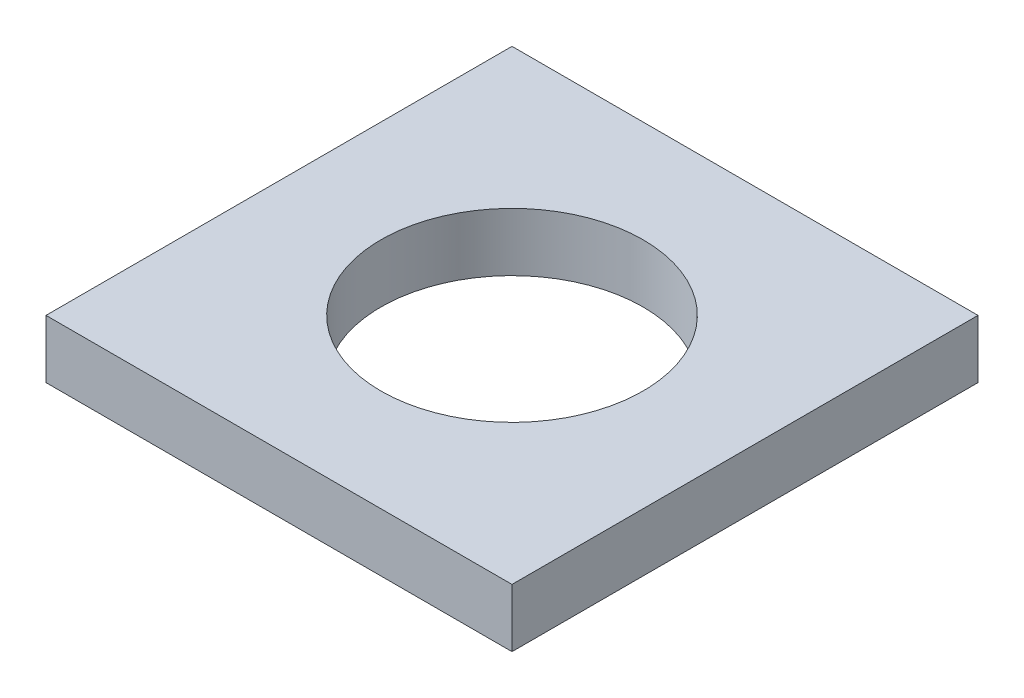
ISO-10303-21;
HEADER;
FILE_DESCRIPTION(('STEP AP214'),'2;1');
FILE_NAME('part.step','',(''),(''),'','','');
FILE_SCHEMA(('AUTOMOTIVE_DESIGN { 1 0 10303 214 1 1 1 1 }'));
ENDSEC;
DATA;
#1=APPLICATION_CONTEXT('core data for automotive mechanical design processes');
#2=APPLICATION_PROTOCOL_DEFINITION('international standard','automotive_design',2000,#1);
#3=PRODUCT_CONTEXT('',#1,'mechanical');
#4=PRODUCT('Part','Part','',(#3));
#5=PRODUCT_RELATED_PRODUCT_CATEGORY('part','',(#4));
#6=PRODUCT_DEFINITION_FORMATION('','',#4);
#7=PRODUCT_DEFINITION_CONTEXT('part definition',#1,'design');
#8=PRODUCT_DEFINITION('design','',#6,#7);
#9=PRODUCT_DEFINITION_SHAPE('','',#8);
#10=(LENGTH_UNIT() NAMED_UNIT(*) SI_UNIT(.MILLI.,.METRE.));
#11=(NAMED_UNIT(*) PLANE_ANGLE_UNIT() SI_UNIT($,.RADIAN.));
#12=(NAMED_UNIT(*) SI_UNIT($,.STERADIAN.) SOLID_ANGLE_UNIT());
#13=UNCERTAINTY_MEASURE_WITH_UNIT(LENGTH_MEASURE(1.E-05),#10,'distance_accuracy_value','');
#14=(GEOMETRIC_REPRESENTATION_CONTEXT(3) GLOBAL_UNCERTAINTY_ASSIGNED_CONTEXT((#13)) GLOBAL_UNIT_ASSIGNED_CONTEXT((#10,
#11,#12)) REPRESENTATION_CONTEXT('',''));
#15=CARTESIAN_POINT('',(0.,0.,0.));
#16=DIRECTION('',(0.,0.,1.));
#17=DIRECTION('',(1.,0.,0.));
#18=AXIS2_PLACEMENT_3D('',#15,#16,#17);
#19=CARTESIAN_POINT('',(0.,12.7,0.));
#20=DIRECTION('',(1.,0.,0.));
#21=DIRECTION('',(0.,0.,-1.));
#22=AXIS2_PLACEMENT_3D('',#19,#20,#21);
#23=PLANE('',#22);
#24=DIRECTION('',(0.,0.,1.));
#25=VECTOR('',#24,1.);
#26=CARTESIAN_POINT('',(0.,0.,0.));
#27=LINE('',#26,#25);
#28=CARTESIAN_POINT('',(0.,0.,-101.6));
#29=VERTEX_POINT('',#28);
#30=CARTESIAN_POINT('',(0.,0.,0.));
#31=VERTEX_POINT('',#30);
#32=EDGE_CURVE('E100',#29,#31,#27,.T.);
#33=ORIENTED_EDGE('',*,*,#32,.T.);
#34=DIRECTION('',(0.,-1.,0.));
#35=VECTOR('',#34,1.);
#36=CARTESIAN_POINT('',(0.,12.7,0.));
#37=LINE('',#36,#35);
#38=CARTESIAN_POINT('',(0.,12.7,0.));
#39=VERTEX_POINT('',#38);
#40=EDGE_CURVE('E11',#39,#31,#37,.T.);
#41=ORIENTED_EDGE('',*,*,#40,.F.);
#42=DIRECTION('',(0.,0.,1.));
#43=VECTOR('',#42,1.);
#44=CARTESIAN_POINT('',(0.,12.7,0.));
#45=LINE('',#44,#43);
#46=CARTESIAN_POINT('',(0.,12.7,-101.6));
#47=VERTEX_POINT('',#46);
#48=EDGE_CURVE('E88',#47,#39,#45,.T.);
#49=ORIENTED_EDGE('',*,*,#48,.F.);
#50=DIRECTION('',(0.,-1.,0.));
#51=VECTOR('',#50,1.);
#52=CARTESIAN_POINT('',(0.,12.7,-101.6));
#53=LINE('',#52,#51);
#54=EDGE_CURVE('E96',#47,#29,#53,.T.);
#55=ORIENTED_EDGE('',*,*,#54,.T.);
#56=EDGE_LOOP('',(#33,#41,#49,#55));
#57=FACE_BOUND('',#56,.T.);
#58=ADVANCED_FACE('F37',(#57),#23,.F.);
#59=CARTESIAN_POINT('',(0.,12.7,0.));
#60=DIRECTION('',(0.,0.,-1.));
#61=DIRECTION('',(-1.,0.,0.));
#62=AXIS2_PLACEMENT_3D('',#59,#60,#61);
#63=PLANE('',#62);
#64=DIRECTION('',(1.,0.,0.));
#65=VECTOR('',#64,1.);
#66=CARTESIAN_POINT('',(0.,0.,0.));
#67=LINE('',#66,#65);
#68=CARTESIAN_POINT('',(101.6,0.,0.));
#69=VERTEX_POINT('',#68);
#70=EDGE_CURVE('E92',#31,#69,#67,.T.);
#71=ORIENTED_EDGE('',*,*,#70,.T.);
#72=DIRECTION('',(0.,-1.,0.));
#73=VECTOR('',#72,1.);
#74=CARTESIAN_POINT('',(101.6,12.7,0.));
#75=LINE('',#74,#73);
#76=CARTESIAN_POINT('',(101.6,12.7,0.));
#77=VERTEX_POINT('',#76);
#78=EDGE_CURVE('E45',#77,#69,#75,.T.);
#79=ORIENTED_EDGE('',*,*,#78,.F.);
#80=DIRECTION('',(1.,0.,0.));
#81=VECTOR('',#80,1.);
#82=CARTESIAN_POINT('',(0.,12.7,0.));
#83=LINE('',#82,#81);
#84=EDGE_CURVE('E83',#39,#77,#83,.T.);
#85=ORIENTED_EDGE('',*,*,#84,.F.);
#86=ORIENTED_EDGE('',*,*,#40,.T.);
#87=EDGE_LOOP('',(#71,#79,#85,#86));
#88=FACE_BOUND('',#87,.T.);
#89=ADVANCED_FACE('F91',(#88),#63,.F.);
#90=CARTESIAN_POINT('',(101.6,12.7,0.));
#91=DIRECTION('',(-1.,0.,0.));
#92=DIRECTION('',(0.,0.,1.));
#93=AXIS2_PLACEMENT_3D('',#90,#91,#92);
#94=PLANE('',#93);
#95=DIRECTION('',(0.,0.,-1.));
#96=VECTOR('',#95,1.);
#97=CARTESIAN_POINT('',(101.6,0.,0.));
#98=LINE('',#97,#96);
#99=CARTESIAN_POINT('',(101.6,0.,-101.6));
#100=VERTEX_POINT('',#99);
#101=EDGE_CURVE('E70',#69,#100,#98,.T.);
#102=ORIENTED_EDGE('',*,*,#101,.T.);
#103=DIRECTION('',(0.,-1.,0.));
#104=VECTOR('',#103,1.);
#105=CARTESIAN_POINT('',(101.6,12.7,-101.6));
#106=LINE('',#105,#104);
#107=CARTESIAN_POINT('',(101.6,12.7,-101.6));
#108=VERTEX_POINT('',#107);
#109=EDGE_CURVE('E93',#108,#100,#106,.T.);
#110=ORIENTED_EDGE('',*,*,#109,.F.);
#111=DIRECTION('',(0.,0.,-1.));
#112=VECTOR('',#111,1.);
#113=CARTESIAN_POINT('',(101.6,12.7,0.));
#114=LINE('',#113,#112);
#115=EDGE_CURVE('E86',#77,#108,#114,.T.);
#116=ORIENTED_EDGE('',*,*,#115,.F.);
#117=ORIENTED_EDGE('',*,*,#78,.T.);
#118=EDGE_LOOP('',(#102,#110,#116,#117));
#119=FACE_BOUND('',#118,.T.);
#120=ADVANCED_FACE('F94',(#119),#94,.F.);
#121=CARTESIAN_POINT('',(0.,12.7,-101.6));
#122=DIRECTION('',(0.,0.,1.));
#123=DIRECTION('',(1.,0.,0.));
#124=AXIS2_PLACEMENT_3D('',#121,#122,#123);
#125=PLANE('',#124);
#126=DIRECTION('',(-1.,0.,0.));
#127=VECTOR('',#126,1.);
#128=CARTESIAN_POINT('',(0.,0.,-101.6));
#129=LINE('',#128,#127);
#130=EDGE_CURVE('E76',#100,#29,#129,.T.);
#131=ORIENTED_EDGE('',*,*,#130,.T.);
#132=ORIENTED_EDGE('',*,*,#54,.F.);
#133=DIRECTION('',(-1.,0.,0.));
#134=VECTOR('',#133,1.);
#135=CARTESIAN_POINT('',(0.,12.7,-101.6));
#136=LINE('',#135,#134);
#137=EDGE_CURVE('E53',#108,#47,#136,.T.);
#138=ORIENTED_EDGE('',*,*,#137,.F.);
#139=ORIENTED_EDGE('',*,*,#109,.T.);
#140=EDGE_LOOP('',(#131,#132,#138,#139));
#141=FACE_BOUND('',#140,.T.);
#142=ADVANCED_FACE('F108',(#141),#125,.F.);
#143=CARTESIAN_POINT('',(0.,12.7,0.));
#144=DIRECTION('',(0.,-1.,0.));
#145=DIRECTION('',(0.,0.,-1.));
#146=AXIS2_PLACEMENT_3D('',#143,#144,#145);
#147=PLANE('',#146);
#148=CARTESIAN_POINT('',(50.8,12.7,-50.8));
#149=DIRECTION('',(0.,-1.,0.));
#150=DIRECTION('',(0.,0.,-1.));
#151=AXIS2_PLACEMENT_3D('',#148,#149,#150);
#152=CIRCLE('',#151,28.575);
#153=CARTESIAN_POINT('',(50.8,12.7,-79.375));
#154=VERTEX_POINT('',#153);
#155=EDGE_CURVE('E103',#154,#154,#152,.T.);
#156=ORIENTED_EDGE('',*,*,#155,.T.);
#157=EDGE_LOOP('',(#156));
#158=FACE_BOUND('',#157,.T.);
#159=ORIENTED_EDGE('',*,*,#48,.T.);
#160=ORIENTED_EDGE('',*,*,#84,.T.);
#161=ORIENTED_EDGE('',*,*,#115,.T.);
#162=ORIENTED_EDGE('',*,*,#137,.T.);
#163=EDGE_LOOP('',(#159,#160,#161,#162));
#164=FACE_BOUND('',#163,.T.);
#165=ADVANCED_FACE('F84',(#158,#164),#147,.F.);
#166=CARTESIAN_POINT('',(0.,0.,0.));
#167=DIRECTION('',(0.,-1.,0.));
#168=DIRECTION('',(0.,0.,-1.));
#169=AXIS2_PLACEMENT_3D('',#166,#167,#168);
#170=PLANE('',#169);
#171=CARTESIAN_POINT('',(50.8,0.,-50.8));
#172=DIRECTION('',(0.,-1.,0.));
#173=DIRECTION('',(0.,0.,-1.));
#174=AXIS2_PLACEMENT_3D('',#171,#172,#173);
#175=CIRCLE('',#174,28.575);
#176=CARTESIAN_POINT('',(50.8,0.,-79.375));
#177=VERTEX_POINT('',#176);
#178=EDGE_CURVE('E114',#177,#177,#175,.T.);
#179=ORIENTED_EDGE('',*,*,#178,.F.);
#180=EDGE_LOOP('',(#179));
#181=FACE_BOUND('',#180,.T.);
#182=ORIENTED_EDGE('',*,*,#32,.F.);
#183=ORIENTED_EDGE('',*,*,#130,.F.);
#184=ORIENTED_EDGE('',*,*,#101,.F.);
#185=ORIENTED_EDGE('',*,*,#70,.F.);
#186=EDGE_LOOP('',(#182,#183,#184,#185));
#187=FACE_BOUND('',#186,.T.);
#188=ADVANCED_FACE('F111',(#181,#187),#170,.T.);
#189=CARTESIAN_POINT('',(50.8,12.7,-50.8));
#190=DIRECTION('',(0.,-1.,0.));
#191=DIRECTION('',(0.,0.,-1.));
#192=AXIS2_PLACEMENT_3D('',#189,#190,#191);
#193=CYLINDRICAL_SURFACE('',#192,28.575);
#194=ORIENTED_EDGE('',*,*,#155,.F.);
#195=EDGE_LOOP('',(#194));
#196=FACE_BOUND('',#195,.T.);
#197=ORIENTED_EDGE('',*,*,#178,.T.);
#198=EDGE_LOOP('',(#197));
#199=FACE_BOUND('',#198,.T.);
#200=ADVANCED_FACE('F121',(#196,#199),#193,.F.);
#201=CLOSED_SHELL('',(#58,#89,#120,#142,#165,#188,#200));
#202=MANIFOLD_SOLID_BREP('B2',#201);
#203=ADVANCED_BREP_SHAPE_REPRESENTATION('',(#18,#202),#14);
#204=SHAPE_DEFINITION_REPRESENTATION(#9,#203);
ENDSEC;
END-ISO-10303-21;
